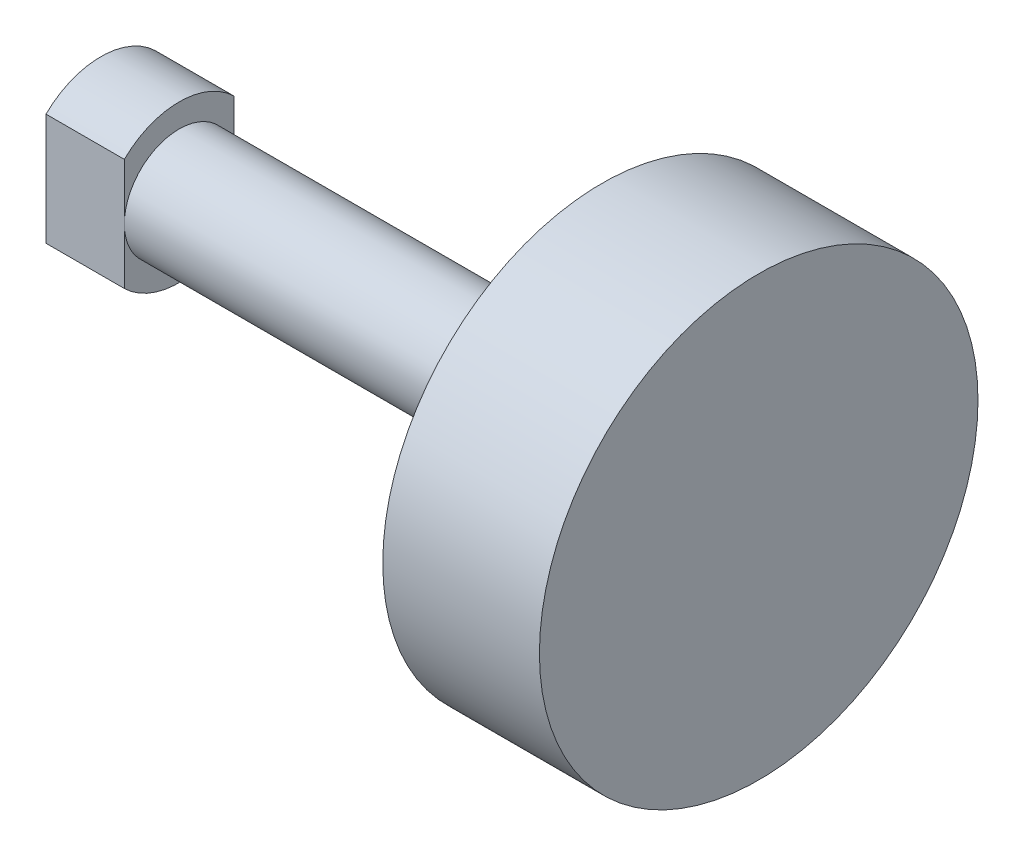
ISO-10303-21;
HEADER;
FILE_DESCRIPTION(('STEP AP214'),'2;1');
FILE_NAME('part.step','',(''),(''),'','','');
FILE_SCHEMA(('AUTOMOTIVE_DESIGN { 1 0 10303 214 1 1 1 1 }'));
ENDSEC;
DATA;
#1=APPLICATION_CONTEXT('core data for automotive mechanical design processes');
#2=APPLICATION_PROTOCOL_DEFINITION('international standard','automotive_design',2000,#1);
#3=PRODUCT_CONTEXT('',#1,'mechanical');
#4=PRODUCT('Part','Part','',(#3));
#5=PRODUCT_RELATED_PRODUCT_CATEGORY('part','',(#4));
#6=PRODUCT_DEFINITION_FORMATION('','',#4);
#7=PRODUCT_DEFINITION_CONTEXT('part definition',#1,'design');
#8=PRODUCT_DEFINITION('design','',#6,#7);
#9=PRODUCT_DEFINITION_SHAPE('','',#8);
#10=(LENGTH_UNIT() NAMED_UNIT(*) SI_UNIT(.MILLI.,.METRE.));
#11=(NAMED_UNIT(*) PLANE_ANGLE_UNIT() SI_UNIT($,.RADIAN.));
#12=(NAMED_UNIT(*) SI_UNIT($,.STERADIAN.) SOLID_ANGLE_UNIT());
#13=UNCERTAINTY_MEASURE_WITH_UNIT(LENGTH_MEASURE(1.E-05),#10,'distance_accuracy_value','');
#14=(GEOMETRIC_REPRESENTATION_CONTEXT(3) GLOBAL_UNCERTAINTY_ASSIGNED_CONTEXT((#13)) GLOBAL_UNIT_ASSIGNED_CONTEXT((#10,
#11,#12)) REPRESENTATION_CONTEXT('',''));
#15=CARTESIAN_POINT('',(0.,0.,0.));
#16=DIRECTION('',(0.,0.,1.));
#17=DIRECTION('',(1.,0.,0.));
#18=AXIS2_PLACEMENT_3D('',#15,#16,#17);
#19=CARTESIAN_POINT('',(-40.9130232431338,0.,0.));
#20=DIRECTION('',(-1.,0.,0.));
#21=DIRECTION('',(0.,0.,1.));
#22=AXIS2_PLACEMENT_3D('',#19,#20,#21);
#23=CYLINDRICAL_SURFACE('',#22,5.);
#24=CARTESIAN_POINT('',(-14.8261266914097,0.,0.));
#25=DIRECTION('',(-1.,0.,0.));
#26=DIRECTION('',(0.,0.,1.));
#27=AXIS2_PLACEMENT_3D('',#24,#25,#26);
#28=CIRCLE('',#27,5.);
#29=CARTESIAN_POINT('',(-14.8261266914097,3.57071421427143,3.5));
#30=VERTEX_POINT('',#29);
#31=CARTESIAN_POINT('',(-14.8261266914097,3.57071421427142,-3.5));
#32=VERTEX_POINT('',#31);
#33=EDGE_CURVE('E112',#30,#32,#28,.T.);
#34=ORIENTED_EDGE('',*,*,#33,.T.);
#35=DIRECTION('',(-1.,0.,0.));
#36=VECTOR('',#35,1.);
#37=CARTESIAN_POINT('',(-40.9130232431338,3.57071421427142,-3.5));
#38=LINE('',#37,#36);
#39=CARTESIAN_POINT('',(-19.8261266914097,3.57071421427143,-3.5));
#40=VERTEX_POINT('',#39);
#41=EDGE_CURVE('E66',#32,#40,#38,.T.);
#42=ORIENTED_EDGE('',*,*,#41,.T.);
#43=CARTESIAN_POINT('',(-19.8261266914097,0.,0.));
#44=DIRECTION('',(-1.,0.,0.));
#45=DIRECTION('',(0.,0.,1.));
#46=AXIS2_PLACEMENT_3D('',#43,#44,#45);
#47=CIRCLE('',#46,5.);
#48=CARTESIAN_POINT('',(-19.8261266914097,3.57071421427143,3.5));
#49=VERTEX_POINT('',#48);
#50=EDGE_CURVE('E13',#49,#40,#47,.T.);
#51=ORIENTED_EDGE('',*,*,#50,.F.);
#52=DIRECTION('',(-1.,0.,0.));
#53=VECTOR('',#52,1.);
#54=CARTESIAN_POINT('',(-40.9130232431338,3.57071421427143,3.5));
#55=LINE('',#54,#53);
#56=EDGE_CURVE('E127',#30,#49,#55,.T.);
#57=ORIENTED_EDGE('',*,*,#56,.F.);
#58=EDGE_LOOP('',(#34,#42,#51,#57));
#59=FACE_BOUND('',#58,.T.);
#60=ADVANCED_FACE('F50',(#59),#23,.T.);
#61=CARTESIAN_POINT('',(-14.8261266914097,5.,0.));
#62=DIRECTION('',(-1.,0.,0.));
#63=DIRECTION('',(0.,0.,1.));
#64=AXIS2_PLACEMENT_3D('',#61,#62,#63);
#65=PLANE('',#64);
#66=CARTESIAN_POINT('',(-14.8261266914097,-3.57071421427143,-3.5));
#67=VERTEX_POINT('',#66);
#68=CARTESIAN_POINT('',(-14.8261266914097,-3.57071421427142,3.5));
#69=VERTEX_POINT('',#68);
#70=EDGE_CURVE('E160',#67,#69,#28,.T.);
#71=ORIENTED_EDGE('',*,*,#70,.F.);
#72=DIRECTION('',(0.,1.,0.));
#73=VECTOR('',#72,1.);
#74=CARTESIAN_POINT('',(-14.8261266914097,5.,-3.5));
#75=LINE('',#74,#73);
#76=CARTESIAN_POINT('',(-14.8261266914097,0.,-3.5));
#77=VERTEX_POINT('',#76);
#78=EDGE_CURVE('E114',#67,#77,#75,.T.);
#79=ORIENTED_EDGE('',*,*,#78,.T.);
#80=CARTESIAN_POINT('',(-14.8261266914097,0.,0.));
#81=DIRECTION('',(-1.,0.,0.));
#82=DIRECTION('',(0.,0.,1.));
#83=AXIS2_PLACEMENT_3D('',#80,#81,#82);
#84=CIRCLE('',#83,3.5);
#85=CARTESIAN_POINT('',(-14.8261266914097,0.,3.5));
#86=VERTEX_POINT('',#85);
#87=EDGE_CURVE('E74',#77,#86,#84,.T.);
#88=ORIENTED_EDGE('',*,*,#87,.T.);
#89=DIRECTION('',(0.,1.,0.));
#90=VECTOR('',#89,1.);
#91=CARTESIAN_POINT('',(-14.8261266914097,5.,3.5));
#92=LINE('',#91,#90);
#93=EDGE_CURVE('E129',#69,#86,#92,.T.);
#94=ORIENTED_EDGE('',*,*,#93,.F.);
#95=EDGE_LOOP('',(#71,#79,#88,#94));
#96=FACE_BOUND('',#95,.T.);
#97=ADVANCED_FACE('F169',(#96),#65,.F.);
#98=CARTESIAN_POINT('',(-19.8261266914097,0.,0.));
#99=DIRECTION('',(1.,0.,0.));
#100=DIRECTION('',(0.,0.,-1.));
#101=AXIS2_PLACEMENT_3D('',#98,#99,#100);
#102=PLANE('',#101);
#103=ORIENTED_EDGE('',*,*,#50,.T.);
#104=DIRECTION('',(0.,-1.,0.));
#105=VECTOR('',#104,1.);
#106=CARTESIAN_POINT('',(-19.8261266914097,13.4938568477374,-3.5));
#107=LINE('',#106,#105);
#108=CARTESIAN_POINT('',(-19.8261266914097,-3.57071421427143,-3.5));
#109=VERTEX_POINT('',#108);
#110=EDGE_CURVE('E98',#40,#109,#107,.T.);
#111=ORIENTED_EDGE('',*,*,#110,.T.);
#112=CARTESIAN_POINT('',(-19.8261266914097,-3.57071421427142,3.5));
#113=VERTEX_POINT('',#112);
#114=EDGE_CURVE('E59',#109,#113,#47,.T.);
#115=ORIENTED_EDGE('',*,*,#114,.T.);
#116=DIRECTION('',(0.,-1.,0.));
#117=VECTOR('',#116,1.);
#118=CARTESIAN_POINT('',(-19.8261266914097,12.7333768027498,3.5));
#119=LINE('',#118,#117);
#120=EDGE_CURVE('E118',#49,#113,#119,.T.);
#121=ORIENTED_EDGE('',*,*,#120,.F.);
#122=EDGE_LOOP('',(#103,#111,#115,#121));
#123=FACE_BOUND('',#122,.T.);
#124=ADVANCED_FACE('F52',(#123),#102,.F.);
#125=ORIENTED_EDGE('',*,*,#114,.F.);
#126=DIRECTION('',(-1.,0.,0.));
#127=VECTOR('',#126,1.);
#128=CARTESIAN_POINT('',(-40.9130232431338,-3.57071421427143,-3.5));
#129=LINE('',#128,#127);
#130=EDGE_CURVE('E101',#109,#67,#129,.F.);
#131=ORIENTED_EDGE('',*,*,#130,.T.);
#132=ORIENTED_EDGE('',*,*,#70,.T.);
#133=DIRECTION('',(-1.,0.,0.));
#134=VECTOR('',#133,1.);
#135=CARTESIAN_POINT('',(-40.9130232431338,-3.57071421427142,3.5));
#136=LINE('',#135,#134);
#137=EDGE_CURVE('E134',#113,#69,#136,.F.);
#138=ORIENTED_EDGE('',*,*,#137,.F.);
#139=EDGE_LOOP('',(#125,#131,#132,#138));
#140=FACE_BOUND('',#139,.T.);
#141=ADVANCED_FACE('F166',(#140),#23,.T.);
#142=EDGE_CURVE('E157',#86,#77,#84,.T.);
#143=ORIENTED_EDGE('',*,*,#142,.T.);
#144=EDGE_CURVE('E105',#77,#32,#75,.T.);
#145=ORIENTED_EDGE('',*,*,#144,.T.);
#146=ORIENTED_EDGE('',*,*,#33,.F.);
#147=EDGE_CURVE('E123',#86,#30,#92,.T.);
#148=ORIENTED_EDGE('',*,*,#147,.F.);
#149=EDGE_LOOP('',(#143,#145,#146,#148));
#150=FACE_BOUND('',#149,.T.);
#151=ADVANCED_FACE('F174',(#150),#65,.F.);
#152=CARTESIAN_POINT('',(-40.9130232431338,0.,0.));
#153=DIRECTION('',(-1.,0.,0.));
#154=DIRECTION('',(0.,0.,1.));
#155=AXIS2_PLACEMENT_3D('',#152,#153,#154);
#156=CYLINDRICAL_SURFACE('',#155,3.5);
#157=ORIENTED_EDGE('',*,*,#87,.F.);
#158=ORIENTED_EDGE('',*,*,#142,.F.);
#159=EDGE_LOOP('',(#157,#158));
#160=FACE_BOUND('',#159,.T.);
#161=CARTESIAN_POINT('',(20.1738733085903,0.,0.));
#162=DIRECTION('',(-1.,0.,0.));
#163=DIRECTION('',(0.,0.,1.));
#164=AXIS2_PLACEMENT_3D('',#161,#162,#163);
#165=CIRCLE('',#164,3.5);
#166=CARTESIAN_POINT('',(20.1738733085903,0.,3.5));
#167=VERTEX_POINT('',#166);
#168=EDGE_CURVE('E153',#167,#167,#165,.T.);
#169=ORIENTED_EDGE('',*,*,#168,.T.);
#170=EDGE_LOOP('',(#169));
#171=FACE_BOUND('',#170,.T.);
#172=ADVANCED_FACE('F181',(#160,#171),#156,.T.);
#173=CARTESIAN_POINT('',(20.1738733085903,3.5,0.));
#174=DIRECTION('',(1.,0.,0.));
#175=DIRECTION('',(0.,0.,-1.));
#176=AXIS2_PLACEMENT_3D('',#173,#174,#175);
#177=PLANE('',#176);
#178=ORIENTED_EDGE('',*,*,#168,.F.);
#179=EDGE_LOOP('',(#178));
#180=FACE_BOUND('',#179,.T.);
#181=CARTESIAN_POINT('',(20.1738733085903,0.,0.));
#182=DIRECTION('',(-1.,0.,0.));
#183=DIRECTION('',(0.,0.,1.));
#184=AXIS2_PLACEMENT_3D('',#181,#182,#183);
#185=CIRCLE('',#184,12.);
#186=CARTESIAN_POINT('',(20.1738733085903,0.,12.));
#187=VERTEX_POINT('',#186);
#188=EDGE_CURVE('E149',#187,#187,#185,.T.);
#189=ORIENTED_EDGE('',*,*,#188,.T.);
#190=EDGE_LOOP('',(#189));
#191=FACE_BOUND('',#190,.T.);
#192=ADVANCED_FACE('F187',(#180,#191),#177,.F.);
#193=CARTESIAN_POINT('',(-40.9130232431338,0.,0.));
#194=DIRECTION('',(-1.,0.,0.));
#195=DIRECTION('',(0.,0.,1.));
#196=AXIS2_PLACEMENT_3D('',#193,#194,#195);
#197=CYLINDRICAL_SURFACE('',#196,12.);
#198=ORIENTED_EDGE('',*,*,#188,.F.);
#199=EDGE_LOOP('',(#198));
#200=FACE_BOUND('',#199,.T.);
#201=CARTESIAN_POINT('',(12.1738733085904,0.,0.));
#202=DIRECTION('',(-1.,0.,0.));
#203=DIRECTION('',(0.,0.,1.));
#204=AXIS2_PLACEMENT_3D('',#201,#202,#203);
#205=CIRCLE('',#204,12.);
#206=CARTESIAN_POINT('',(12.1738733085904,0.,12.));
#207=VERTEX_POINT('',#206);
#208=EDGE_CURVE('E145',#207,#207,#205,.T.);
#209=ORIENTED_EDGE('',*,*,#208,.T.);
#210=EDGE_LOOP('',(#209));
#211=FACE_BOUND('',#210,.T.);
#212=ADVANCED_FACE('F195',(#200,#211),#197,.F.);
#213=CARTESIAN_POINT('',(12.1738733085903,12.,0.));
#214=DIRECTION('',(1.,0.,0.));
#215=DIRECTION('',(0.,0.,-1.));
#216=AXIS2_PLACEMENT_3D('',#213,#214,#215);
#217=PLANE('',#216);
#218=ORIENTED_EDGE('',*,*,#208,.F.);
#219=EDGE_LOOP('',(#218));
#220=FACE_BOUND('',#219,.T.);
#221=CARTESIAN_POINT('',(12.1738733085904,0.,0.));
#222=DIRECTION('',(-1.,0.,0.));
#223=DIRECTION('',(0.,0.,1.));
#224=AXIS2_PLACEMENT_3D('',#221,#222,#223);
#225=CIRCLE('',#224,14.);
#226=CARTESIAN_POINT('',(12.1738733085904,0.,14.));
#227=VERTEX_POINT('',#226);
#228=EDGE_CURVE('E141',#227,#227,#225,.T.);
#229=ORIENTED_EDGE('',*,*,#228,.T.);
#230=EDGE_LOOP('',(#229));
#231=FACE_BOUND('',#230,.T.);
#232=ADVANCED_FACE('F201',(#220,#231),#217,.F.);
#233=CARTESIAN_POINT('',(-40.9130232431338,0.,0.));
#234=DIRECTION('',(-1.,0.,0.));
#235=DIRECTION('',(0.,0.,1.));
#236=AXIS2_PLACEMENT_3D('',#233,#234,#235);
#237=CYLINDRICAL_SURFACE('',#236,14.);
#238=ORIENTED_EDGE('',*,*,#228,.F.);
#239=EDGE_LOOP('',(#238));
#240=FACE_BOUND('',#239,.T.);
#241=CARTESIAN_POINT('',(22.1738733085903,0.,0.));
#242=DIRECTION('',(-1.,0.,0.));
#243=DIRECTION('',(0.,0.,1.));
#244=AXIS2_PLACEMENT_3D('',#241,#242,#243);
#245=CIRCLE('',#244,14.);
#246=CARTESIAN_POINT('',(22.1738733085903,0.,14.));
#247=VERTEX_POINT('',#246);
#248=EDGE_CURVE('E137',#247,#247,#245,.T.);
#249=ORIENTED_EDGE('',*,*,#248,.T.);
#250=EDGE_LOOP('',(#249));
#251=FACE_BOUND('',#250,.T.);
#252=ADVANCED_FACE('F207',(#240,#251),#237,.T.);
#253=CARTESIAN_POINT('',(22.1738733085903,14.,0.));
#254=DIRECTION('',(-1.,0.,0.));
#255=DIRECTION('',(0.,0.,1.));
#256=AXIS2_PLACEMENT_3D('',#253,#254,#255);
#257=PLANE('',#256);
#258=ORIENTED_EDGE('',*,*,#248,.F.);
#259=EDGE_LOOP('',(#258));
#260=FACE_BOUND('',#259,.T.);
#261=ADVANCED_FACE('F213',(#260),#257,.F.);
#262=CARTESIAN_POINT('',(-19.8261266914097,12.7333768027498,3.5));
#263=DIRECTION('',(0.,0.,1.));
#264=DIRECTION('',(0.,-1.,0.));
#265=AXIS2_PLACEMENT_3D('',#262,#263,#264);
#266=PLANE('',#265);
#267=ORIENTED_EDGE('',*,*,#137,.T.);
#268=ORIENTED_EDGE('',*,*,#93,.T.);
#269=ORIENTED_EDGE('',*,*,#147,.T.);
#270=ORIENTED_EDGE('',*,*,#56,.T.);
#271=ORIENTED_EDGE('',*,*,#120,.T.);
#272=EDGE_LOOP('',(#267,#268,#269,#270,#271));
#273=FACE_BOUND('',#272,.T.);
#274=ADVANCED_FACE('F167',(#273),#266,.T.);
#275=CARTESIAN_POINT('',(-19.8261266914097,13.4938568477374,-3.5));
#276=DIRECTION('',(0.,0.,1.));
#277=DIRECTION('',(0.,-1.,0.));
#278=AXIS2_PLACEMENT_3D('',#275,#276,#277);
#279=PLANE('',#278);
#280=ORIENTED_EDGE('',*,*,#110,.F.);
#281=ORIENTED_EDGE('',*,*,#41,.F.);
#282=ORIENTED_EDGE('',*,*,#144,.F.);
#283=ORIENTED_EDGE('',*,*,#78,.F.);
#284=ORIENTED_EDGE('',*,*,#130,.F.);
#285=EDGE_LOOP('',(#280,#281,#282,#283,#284));
#286=FACE_BOUND('',#285,.T.);
#287=ADVANCED_FACE('F99',(#286),#279,.F.);
#288=CLOSED_SHELL('',(#60,#97,#124,#141,#151,#172,#192,#212,#232,#252,#261,#274,#287));
#289=MANIFOLD_SOLID_BREP('B2',#288);
#290=ADVANCED_BREP_SHAPE_REPRESENTATION('',(#18,#289),#14);
#291=SHAPE_DEFINITION_REPRESENTATION(#9,#290);
ENDSEC;
END-ISO-10303-21;
